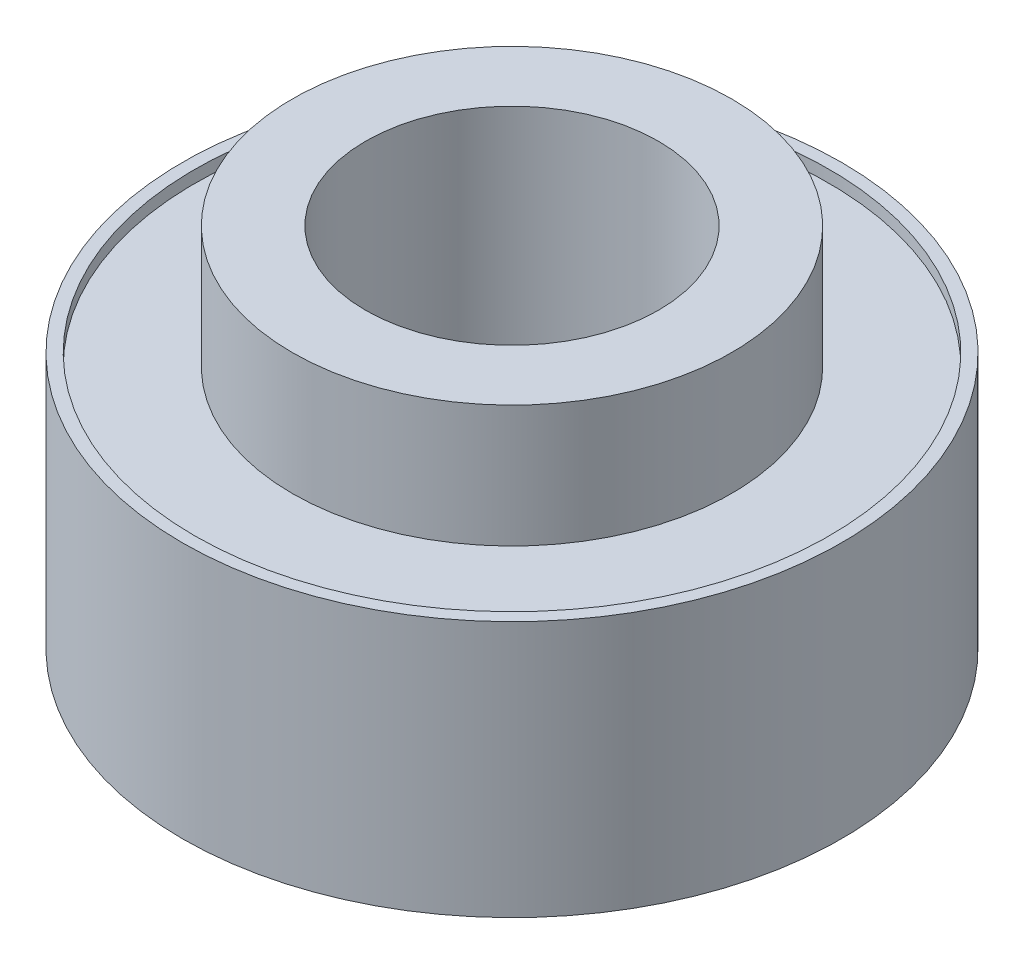
ISO-10303-21;
HEADER;
FILE_DESCRIPTION(('STEP AP214'),'2;1');
FILE_NAME('part.step','',(''),(''),'','','');
FILE_SCHEMA(('AUTOMOTIVE_DESIGN { 1 0 10303 214 1 1 1 1 }'));
ENDSEC;
DATA;
#1=APPLICATION_CONTEXT('core data for automotive mechanical design processes');
#2=APPLICATION_PROTOCOL_DEFINITION('international standard','automotive_design',2000,#1);
#3=PRODUCT_CONTEXT('',#1,'mechanical');
#4=PRODUCT('Part','Part','',(#3));
#5=PRODUCT_RELATED_PRODUCT_CATEGORY('part','',(#4));
#6=PRODUCT_DEFINITION_FORMATION('','',#4);
#7=PRODUCT_DEFINITION_CONTEXT('part definition',#1,'design');
#8=PRODUCT_DEFINITION('design','',#6,#7);
#9=PRODUCT_DEFINITION_SHAPE('','',#8);
#10=(LENGTH_UNIT() NAMED_UNIT(*) SI_UNIT(.MILLI.,.METRE.));
#11=(NAMED_UNIT(*) PLANE_ANGLE_UNIT() SI_UNIT($,.RADIAN.));
#12=(NAMED_UNIT(*) SI_UNIT($,.STERADIAN.) SOLID_ANGLE_UNIT());
#13=UNCERTAINTY_MEASURE_WITH_UNIT(LENGTH_MEASURE(1.E-05),#10,'distance_accuracy_value','');
#14=(GEOMETRIC_REPRESENTATION_CONTEXT(3) GLOBAL_UNCERTAINTY_ASSIGNED_CONTEXT((#13)) GLOBAL_UNIT_ASSIGNED_CONTEXT((#10,
#11,#12)) REPRESENTATION_CONTEXT('',''));
#15=CARTESIAN_POINT('',(0.,0.,0.));
#16=DIRECTION('',(0.,0.,1.));
#17=DIRECTION('',(1.,0.,0.));
#18=AXIS2_PLACEMENT_3D('',#15,#16,#17);
#19=CARTESIAN_POINT('',(0.,0.5,0.));
#20=DIRECTION('',(0.,-1.,0.));
#21=DIRECTION('',(0.,0.,-1.));
#22=AXIS2_PLACEMENT_3D('',#19,#20,#21);
#23=PLANE('',#22);
#24=CARTESIAN_POINT('',(0.,0.5,0.));
#25=DIRECTION('',(0.,-1.,0.));
#26=DIRECTION('',(0.,0.,-1.));
#27=AXIS2_PLACEMENT_3D('',#24,#25,#26);
#28=CIRCLE('',#27,13.);
#29=CARTESIAN_POINT('',(0.,0.5,-13.));
#30=VERTEX_POINT('',#29);
#31=EDGE_CURVE('E63',#30,#30,#28,.T.);
#32=ORIENTED_EDGE('',*,*,#31,.T.);
#33=EDGE_LOOP('',(#32));
#34=FACE_BOUND('',#33,.T.);
#35=CARTESIAN_POINT('',(0.,0.5,0.));
#36=DIRECTION('',(0.,-1.,0.));
#37=DIRECTION('',(0.,0.,-1.));
#38=AXIS2_PLACEMENT_3D('',#35,#36,#37);
#39=CIRCLE('',#38,9.);
#40=CARTESIAN_POINT('',(0.,0.5,-9.));
#41=VERTEX_POINT('',#40);
#42=EDGE_CURVE('E81',#41,#41,#39,.T.);
#43=ORIENTED_EDGE('',*,*,#42,.F.);
#44=EDGE_LOOP('',(#43));
#45=FACE_BOUND('',#44,.T.);
#46=ADVANCED_FACE('F47',(#34,#45),#23,.T.);
#47=CARTESIAN_POINT('',(0.,10.,0.));
#48=DIRECTION('',(0.,1.,0.));
#49=DIRECTION('',(0.,0.,1.));
#50=AXIS2_PLACEMENT_3D('',#47,#48,#49);
#51=PLANE('',#50);
#52=CARTESIAN_POINT('',(0.,10.,0.));
#53=DIRECTION('',(0.,1.,0.));
#54=DIRECTION('',(0.,0.,1.));
#55=AXIS2_PLACEMENT_3D('',#52,#53,#54);
#56=CIRCLE('',#55,13.);
#57=CARTESIAN_POINT('',(0.,10.,13.));
#58=VERTEX_POINT('',#57);
#59=EDGE_CURVE('E58',#58,#58,#56,.T.);
#60=ORIENTED_EDGE('',*,*,#59,.T.);
#61=EDGE_LOOP('',(#60));
#62=FACE_BOUND('',#61,.T.);
#63=CARTESIAN_POINT('',(0.,10.,0.));
#64=DIRECTION('',(0.,1.,0.));
#65=DIRECTION('',(0.,0.,1.));
#66=AXIS2_PLACEMENT_3D('',#63,#64,#65);
#67=CIRCLE('',#66,9.);
#68=CARTESIAN_POINT('',(0.,10.,9.));
#69=VERTEX_POINT('',#68);
#70=EDGE_CURVE('E72',#69,#69,#67,.T.);
#71=ORIENTED_EDGE('',*,*,#70,.F.);
#72=EDGE_LOOP('',(#71));
#73=FACE_BOUND('',#72,.T.);
#74=ADVANCED_FACE('F109',(#62,#73),#51,.T.);
#75=CARTESIAN_POINT('',(0.,10.5,0.));
#76=DIRECTION('',(0.,-1.,0.));
#77=DIRECTION('',(0.,0.,-1.));
#78=AXIS2_PLACEMENT_3D('',#75,#76,#77);
#79=CYLINDRICAL_SURFACE('',#78,13.5);
#80=CARTESIAN_POINT('',(0.,10.5,0.));
#81=DIRECTION('',(0.,1.,0.));
#82=DIRECTION('',(0.,0.,1.));
#83=AXIS2_PLACEMENT_3D('',#80,#81,#82);
#84=CIRCLE('',#83,13.5);
#85=CARTESIAN_POINT('',(0.,10.5,-13.5));
#86=VERTEX_POINT('',#85);
#87=EDGE_CURVE('E10',#86,#86,#84,.T.);
#88=CARTESIAN_POINT('',(0.,0.,0.));
#89=DIRECTION('',(0.,1.,0.));
#90=DIRECTION('',(0.,0.,1.));
#91=AXIS2_PLACEMENT_3D('',#88,#89,#90);
#92=CIRCLE('',#91,13.5);
#93=CARTESIAN_POINT('',(0.,0.,-13.5));
#94=VERTEX_POINT('',#93);
#95=EDGE_CURVE('E51',#94,#94,#92,.T.);
#96=CARTESIAN_POINT('',(0.,10.5,-13.5));
#97=CARTESIAN_POINT('',(0.,10.390625,-13.5));
#98=CARTESIAN_POINT('',(0.,10.28125,-13.5));
#99=CARTESIAN_POINT('',(0.,10.0625,-13.5));
#100=CARTESIAN_POINT('',(0.,9.953125,-13.5));
#101=CARTESIAN_POINT('',(0.,9.734375,-13.5));
#102=CARTESIAN_POINT('',(0.,9.625,-13.5));
#103=CARTESIAN_POINT('',(0.,9.40625,-13.5));
#104=CARTESIAN_POINT('',(0.,9.296875,-13.5));
#105=CARTESIAN_POINT('',(0.,9.078125,-13.5));
#106=CARTESIAN_POINT('',(0.,8.96875,-13.5));
#107=CARTESIAN_POINT('',(0.,8.75,-13.5));
#108=CARTESIAN_POINT('',(0.,8.640625,-13.5));
#109=CARTESIAN_POINT('',(0.,8.421875,-13.5));
#110=CARTESIAN_POINT('',(0.,8.3125,-13.5));
#111=CARTESIAN_POINT('',(0.,8.09375,-13.5));
#112=CARTESIAN_POINT('',(0.,7.984375,-13.5));
#113=CARTESIAN_POINT('',(0.,7.765625,-13.5));
#114=CARTESIAN_POINT('',(0.,7.65625,-13.5));
#115=CARTESIAN_POINT('',(0.,7.4375,-13.5));
#116=CARTESIAN_POINT('',(0.,7.328125,-13.5));
#117=CARTESIAN_POINT('',(0.,7.109375,-13.5));
#118=CARTESIAN_POINT('',(0.,7.,-13.5));
#119=CARTESIAN_POINT('',(0.,6.78125,-13.5));
#120=CARTESIAN_POINT('',(0.,6.671875,-13.5));
#121=CARTESIAN_POINT('',(0.,6.453125,-13.5));
#122=CARTESIAN_POINT('',(0.,6.34375,-13.5));
#123=CARTESIAN_POINT('',(0.,6.125,-13.5));
#124=CARTESIAN_POINT('',(0.,6.015625,-13.5));
#125=CARTESIAN_POINT('',(0.,5.796875,-13.5));
#126=CARTESIAN_POINT('',(0.,5.6875,-13.5));
#127=CARTESIAN_POINT('',(0.,5.46875,-13.5));
#128=CARTESIAN_POINT('',(0.,5.359375,-13.5));
#129=CARTESIAN_POINT('',(0.,5.140625,-13.5));
#130=CARTESIAN_POINT('',(0.,5.03125,-13.5));
#131=CARTESIAN_POINT('',(0.,4.8125,-13.5));
#132=CARTESIAN_POINT('',(0.,4.703125,-13.5));
#133=CARTESIAN_POINT('',(0.,4.484375,-13.5));
#134=CARTESIAN_POINT('',(0.,4.375,-13.5));
#135=CARTESIAN_POINT('',(0.,4.15625,-13.5));
#136=CARTESIAN_POINT('',(0.,4.046875,-13.5));
#137=CARTESIAN_POINT('',(0.,3.828125,-13.5));
#138=CARTESIAN_POINT('',(0.,3.71875,-13.5));
#139=CARTESIAN_POINT('',(0.,3.5,-13.5));
#140=CARTESIAN_POINT('',(0.,3.390625,-13.5));
#141=CARTESIAN_POINT('',(0.,3.171875,-13.5));
#142=CARTESIAN_POINT('',(0.,3.0625,-13.5));
#143=CARTESIAN_POINT('',(0.,2.84375,-13.5));
#144=CARTESIAN_POINT('',(0.,2.734375,-13.5));
#145=CARTESIAN_POINT('',(0.,2.515625,-13.5));
#146=CARTESIAN_POINT('',(0.,2.40625,-13.5));
#147=CARTESIAN_POINT('',(0.,2.1875,-13.5));
#148=CARTESIAN_POINT('',(0.,2.078125,-13.5));
#149=CARTESIAN_POINT('',(0.,1.859375,-13.5));
#150=CARTESIAN_POINT('',(0.,1.75,-13.5));
#151=CARTESIAN_POINT('',(0.,1.53125,-13.5));
#152=CARTESIAN_POINT('',(0.,1.421875,-13.5));
#153=CARTESIAN_POINT('',(0.,1.203125,-13.5));
#154=CARTESIAN_POINT('',(0.,1.09375,-13.5));
#155=CARTESIAN_POINT('',(0.,0.875000000000001,-13.5));
#156=CARTESIAN_POINT('',(0.,0.765625000000001,-13.5));
#157=CARTESIAN_POINT('',(0.,0.546875,-13.5));
#158=CARTESIAN_POINT('',(0.,0.4375,-13.5));
#159=CARTESIAN_POINT('',(0.,0.21875,-13.5));
#160=CARTESIAN_POINT('',(0.,0.109375,-13.5));
#161=CARTESIAN_POINT('',(0.,0.,-13.5));
#162=B_SPLINE_CURVE_WITH_KNOTS('',3,(#96,#97,#98,#99,#100,#101,#102,#103,#104,#105,#106,#107,
#108,#109,#110,#111,#112,#113,#114,#115,#116,#117,#118,#119,#120,#121,#122,#123,#124,#125,#126,
#127,#128,#129,#130,#131,#132,#133,#134,#135,#136,#137,#138,#139,#140,#141,#142,#143,#144,#145,
#146,#147,#148,#149,#150,#151,#152,#153,#154,#155,#156,#157,#158,#159,#160,#161),.UNSPECIFIED.,
.F.,.F.,(4,2,2,2,2,2,2,2,2,2,2,2,2,2,2,2,2,2,2,2,2,2,2,2,2,2,2,2,2,2,2,2,4),(0.,0.328125,
0.656250000000001,0.984375000000001,1.3125,1.640625,1.96875,2.296875,2.625,2.953125,3.28125,
3.609375,3.9375,4.265625,4.59375,4.921875,5.25,5.578125,5.90625,6.234375,6.5625,6.890625,
7.21875,7.546875,7.875,8.203125,8.53125,8.859375,9.1875,9.515625,9.84375,10.171875,10.5),.UNSPECIFIED.);
#163=EDGE_CURVE('BSEAM49',#86,#94,#162,.T.);
#164=ORIENTED_EDGE('',*,*,#87,.F.);
#165=ORIENTED_EDGE('',*,*,#95,.T.);
#166=ORIENTED_EDGE('',*,*,#163,.T.);
#167=ORIENTED_EDGE('',*,*,#163,.F.);
#168=EDGE_LOOP('',(#164,#166,#165,#167));
#169=FACE_BOUND('',#168,.T.);
#170=ADVANCED_FACE('F49',(#169),#79,.T.);
#171=CARTESIAN_POINT('',(0.,10.5,0.));
#172=DIRECTION('',(0.,1.,0.));
#173=DIRECTION('',(0.,0.,1.));
#174=AXIS2_PLACEMENT_3D('',#171,#172,#173);
#175=PLANE('',#174);
#176=CARTESIAN_POINT('',(0.,10.5,0.));
#177=DIRECTION('',(0.,1.,0.));
#178=DIRECTION('',(0.,0.,1.));
#179=AXIS2_PLACEMENT_3D('',#176,#177,#178);
#180=CIRCLE('',#179,13.);
#181=CARTESIAN_POINT('',(0.,10.5,13.));
#182=VERTEX_POINT('',#181);
#183=EDGE_CURVE('E60',#182,#182,#180,.T.);
#184=ORIENTED_EDGE('',*,*,#183,.F.);
#185=EDGE_LOOP('',(#184));
#186=FACE_BOUND('',#185,.T.);
#187=ORIENTED_EDGE('',*,*,#87,.T.);
#188=EDGE_LOOP('',(#187));
#189=FACE_BOUND('',#188,.T.);
#190=ADVANCED_FACE('F129',(#186,#189),#175,.T.);
#191=CARTESIAN_POINT('',(0.,0.,0.));
#192=DIRECTION('',(0.,1.,0.));
#193=DIRECTION('',(0.,0.,1.));
#194=AXIS2_PLACEMENT_3D('',#191,#192,#193);
#195=PLANE('',#194);
#196=CARTESIAN_POINT('',(0.,0.,0.));
#197=DIRECTION('',(0.,-1.,0.));
#198=DIRECTION('',(0.,0.,-1.));
#199=AXIS2_PLACEMENT_3D('',#196,#197,#198);
#200=CIRCLE('',#199,13.);
#201=CARTESIAN_POINT('',(0.,0.,-13.));
#202=VERTEX_POINT('',#201);
#203=EDGE_CURVE('E66',#202,#202,#200,.T.);
#204=ORIENTED_EDGE('',*,*,#203,.F.);
#205=EDGE_LOOP('',(#204));
#206=FACE_BOUND('',#205,.T.);
#207=ORIENTED_EDGE('',*,*,#95,.F.);
#208=EDGE_LOOP('',(#207));
#209=FACE_BOUND('',#208,.T.);
#210=ADVANCED_FACE('F127',(#206,#209),#195,.F.);
#211=CARTESIAN_POINT('',(0.,10.,0.));
#212=DIRECTION('',(0.,1.,0.));
#213=DIRECTION('',(0.,0.,1.));
#214=AXIS2_PLACEMENT_3D('',#211,#212,#213);
#215=CYLINDRICAL_SURFACE('',#214,13.);
#216=ORIENTED_EDGE('',*,*,#59,.F.);
#217=EDGE_LOOP('',(#216));
#218=FACE_BOUND('',#217,.T.);
#219=ORIENTED_EDGE('',*,*,#183,.T.);
#220=EDGE_LOOP('',(#219));
#221=FACE_BOUND('',#220,.T.);
#222=ADVANCED_FACE('F122',(#218,#221),#215,.F.);
#223=CARTESIAN_POINT('',(0.,0.5,0.));
#224=DIRECTION('',(0.,-1.,0.));
#225=DIRECTION('',(0.,0.,-1.));
#226=AXIS2_PLACEMENT_3D('',#223,#224,#225);
#227=CYLINDRICAL_SURFACE('',#226,13.);
#228=ORIENTED_EDGE('',*,*,#31,.F.);
#229=EDGE_LOOP('',(#228));
#230=FACE_BOUND('',#229,.T.);
#231=ORIENTED_EDGE('',*,*,#203,.T.);
#232=EDGE_LOOP('',(#231));
#233=FACE_BOUND('',#232,.T.);
#234=ADVANCED_FACE('F120',(#230,#233),#227,.F.);
#235=CARTESIAN_POINT('',(0.,0.,0.));
#236=DIRECTION('',(0.,1.,0.));
#237=DIRECTION('',(0.,0.,1.));
#238=AXIS2_PLACEMENT_3D('',#235,#236,#237);
#239=CYLINDRICAL_SURFACE('',#238,6.);
#240=CARTESIAN_POINT('',(0.,15.,0.));
#241=DIRECTION('',(0.,1.,0.));
#242=DIRECTION('',(0.,0.,1.));
#243=AXIS2_PLACEMENT_3D('',#240,#241,#242);
#244=CIRCLE('',#243,6.);
#245=CARTESIAN_POINT('',(0.,15.,6.));
#246=VERTEX_POINT('',#245);
#247=EDGE_CURVE('E75',#246,#246,#244,.T.);
#248=ORIENTED_EDGE('',*,*,#247,.T.);
#249=EDGE_LOOP('',(#248));
#250=FACE_BOUND('',#249,.T.);
#251=CARTESIAN_POINT('',(0.,-1.,0.));
#252=DIRECTION('',(0.,-1.,0.));
#253=DIRECTION('',(0.,0.,-1.));
#254=AXIS2_PLACEMENT_3D('',#251,#252,#253);
#255=CIRCLE('',#254,6.);
#256=CARTESIAN_POINT('',(0.,-1.,-6.));
#257=VERTEX_POINT('',#256);
#258=EDGE_CURVE('E84',#257,#257,#255,.T.);
#259=ORIENTED_EDGE('',*,*,#258,.T.);
#260=EDGE_LOOP('',(#259));
#261=FACE_BOUND('',#260,.T.);
#262=ADVANCED_FACE('F90',(#250,#261),#239,.F.);
#263=CARTESIAN_POINT('',(0.,15.,0.));
#264=DIRECTION('',(0.,1.,0.));
#265=DIRECTION('',(0.,0.,1.));
#266=AXIS2_PLACEMENT_3D('',#263,#264,#265);
#267=PLANE('',#266);
#268=CARTESIAN_POINT('',(0.,15.,0.));
#269=DIRECTION('',(0.,1.,0.));
#270=DIRECTION('',(0.,0.,1.));
#271=AXIS2_PLACEMENT_3D('',#268,#269,#270);
#272=CIRCLE('',#271,9.);
#273=CARTESIAN_POINT('',(0.,15.,9.));
#274=VERTEX_POINT('',#273);
#275=EDGE_CURVE('E69',#274,#274,#272,.T.);
#276=ORIENTED_EDGE('',*,*,#275,.T.);
#277=EDGE_LOOP('',(#276));
#278=FACE_BOUND('',#277,.T.);
#279=ORIENTED_EDGE('',*,*,#247,.F.);
#280=EDGE_LOOP('',(#279));
#281=FACE_BOUND('',#280,.T.);
#282=ADVANCED_FACE('F105',(#278,#281),#267,.T.);
#283=CARTESIAN_POINT('',(0.,15.,0.));
#284=DIRECTION('',(0.,-1.,0.));
#285=DIRECTION('',(0.,0.,-1.));
#286=AXIS2_PLACEMENT_3D('',#283,#284,#285);
#287=CYLINDRICAL_SURFACE('',#286,9.);
#288=ORIENTED_EDGE('',*,*,#275,.F.);
#289=EDGE_LOOP('',(#288));
#290=FACE_BOUND('',#289,.T.);
#291=ORIENTED_EDGE('',*,*,#70,.T.);
#292=EDGE_LOOP('',(#291));
#293=FACE_BOUND('',#292,.T.);
#294=ADVANCED_FACE('F95',(#290,#293),#287,.T.);
#295=CARTESIAN_POINT('',(0.,-1.,0.));
#296=DIRECTION('',(0.,-1.,0.));
#297=DIRECTION('',(0.,0.,-1.));
#298=AXIS2_PLACEMENT_3D('',#295,#296,#297);
#299=PLANE('',#298);
#300=CARTESIAN_POINT('',(0.,-1.,0.));
#301=DIRECTION('',(0.,-1.,0.));
#302=DIRECTION('',(0.,0.,-1.));
#303=AXIS2_PLACEMENT_3D('',#300,#301,#302);
#304=CIRCLE('',#303,9.);
#305=CARTESIAN_POINT('',(0.,-1.,-9.));
#306=VERTEX_POINT('',#305);
#307=EDGE_CURVE('E80',#306,#306,#304,.T.);
#308=ORIENTED_EDGE('',*,*,#307,.T.);
#309=EDGE_LOOP('',(#308));
#310=FACE_BOUND('',#309,.T.);
#311=ORIENTED_EDGE('',*,*,#258,.F.);
#312=EDGE_LOOP('',(#311));
#313=FACE_BOUND('',#312,.T.);
#314=ADVANCED_FACE('F92',(#310,#313),#299,.T.);
#315=CARTESIAN_POINT('',(0.,-1.,0.));
#316=DIRECTION('',(0.,1.,0.));
#317=DIRECTION('',(0.,0.,1.));
#318=AXIS2_PLACEMENT_3D('',#315,#316,#317);
#319=CYLINDRICAL_SURFACE('',#318,9.);
#320=ORIENTED_EDGE('',*,*,#307,.F.);
#321=EDGE_LOOP('',(#320));
#322=FACE_BOUND('',#321,.T.);
#323=ORIENTED_EDGE('',*,*,#42,.T.);
#324=EDGE_LOOP('',(#323));
#325=FACE_BOUND('',#324,.T.);
#326=ADVANCED_FACE('F94',(#322,#325),#319,.T.);
#327=CLOSED_SHELL('',(#46,#74,#170,#190,#210,#222,#234,#262,#282,#294,#314,#326));
#328=MANIFOLD_SOLID_BREP('B2',#327);
#329=ADVANCED_BREP_SHAPE_REPRESENTATION('',(#18,#328),#14);
#330=SHAPE_DEFINITION_REPRESENTATION(#9,#329);
ENDSEC;
END-ISO-10303-21;
